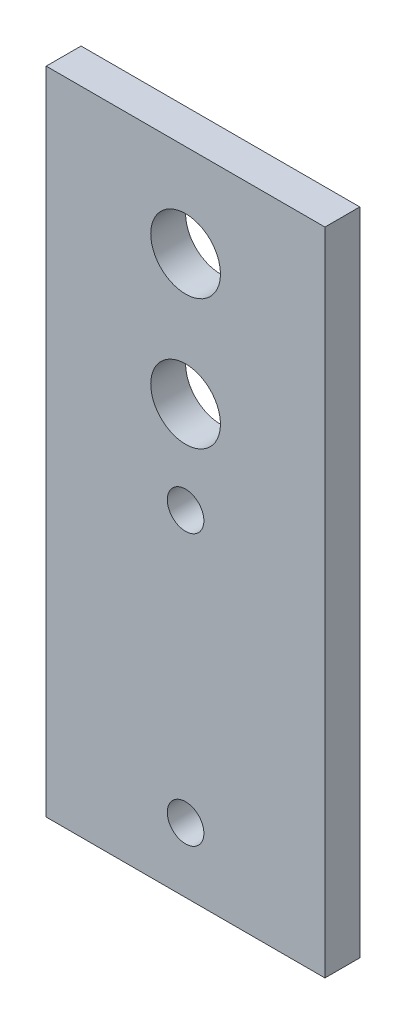
ISO-10303-21;
HEADER;
FILE_DESCRIPTION(('STEP AP214'),'2;1');
FILE_NAME('part.step','',(''),(''),'','','');
FILE_SCHEMA(('AUTOMOTIVE_DESIGN { 1 0 10303 214 1 1 1 1 }'));
ENDSEC;
DATA;
#1=APPLICATION_CONTEXT('core data for automotive mechanical design processes');
#2=APPLICATION_PROTOCOL_DEFINITION('international standard','automotive_design',2000,#1);
#3=PRODUCT_CONTEXT('',#1,'mechanical');
#4=PRODUCT('Part','Part','',(#3));
#5=PRODUCT_RELATED_PRODUCT_CATEGORY('part','',(#4));
#6=PRODUCT_DEFINITION_FORMATION('','',#4);
#7=PRODUCT_DEFINITION_CONTEXT('part definition',#1,'design');
#8=PRODUCT_DEFINITION('design','',#6,#7);
#9=PRODUCT_DEFINITION_SHAPE('','',#8);
#10=(LENGTH_UNIT() NAMED_UNIT(*) SI_UNIT(.MILLI.,.METRE.));
#11=(NAMED_UNIT(*) PLANE_ANGLE_UNIT() SI_UNIT($,.RADIAN.));
#12=(NAMED_UNIT(*) SI_UNIT($,.STERADIAN.) SOLID_ANGLE_UNIT());
#13=UNCERTAINTY_MEASURE_WITH_UNIT(LENGTH_MEASURE(1.E-05),#10,'distance_accuracy_value','');
#14=(GEOMETRIC_REPRESENTATION_CONTEXT(3) GLOBAL_UNCERTAINTY_ASSIGNED_CONTEXT((#13)) GLOBAL_UNIT_ASSIGNED_CONTEXT((#10,
#11,#12)) REPRESENTATION_CONTEXT('',''));
#15=CARTESIAN_POINT('',(0.,0.,0.));
#16=DIRECTION('',(0.,0.,1.));
#17=DIRECTION('',(1.,0.,0.));
#18=AXIS2_PLACEMENT_3D('',#15,#16,#17);
#19=CARTESIAN_POINT('',(0.,0.,4.7625));
#20=DIRECTION('',(0.,0.,-1.));
#21=DIRECTION('',(-1.,0.,0.));
#22=AXIS2_PLACEMENT_3D('',#19,#20,#21);
#23=PLANE('',#22);
#24=DIRECTION('',(0.,-1.,0.));
#25=VECTOR('',#24,1.);
#26=CARTESIAN_POINT('',(0.,0.,4.7625));
#27=LINE('',#26,#25);
#28=CARTESIAN_POINT('',(0.,88.9,4.7625));
#29=VERTEX_POINT('',#28);
#30=CARTESIAN_POINT('',(0.,0.,4.7625));
#31=VERTEX_POINT('',#30);
#32=EDGE_CURVE('E93',#29,#31,#27,.T.);
#33=ORIENTED_EDGE('',*,*,#32,.T.);
#34=DIRECTION('',(1.,0.,0.));
#35=VECTOR('',#34,1.);
#36=CARTESIAN_POINT('',(0.,0.,4.7625));
#37=LINE('',#36,#35);
#38=CARTESIAN_POINT('',(38.1,0.,4.7625));
#39=VERTEX_POINT('',#38);
#40=EDGE_CURVE('E88',#31,#39,#37,.T.);
#41=ORIENTED_EDGE('',*,*,#40,.T.);
#42=DIRECTION('',(0.,1.,0.));
#43=VECTOR('',#42,1.);
#44=CARTESIAN_POINT('',(38.1,0.,4.7625));
#45=LINE('',#44,#43);
#46=CARTESIAN_POINT('',(38.1,88.9,4.7625));
#47=VERTEX_POINT('',#46);
#48=EDGE_CURVE('E91',#39,#47,#45,.T.);
#49=ORIENTED_EDGE('',*,*,#48,.T.);
#50=DIRECTION('',(-1.,0.,0.));
#51=VECTOR('',#50,1.);
#52=CARTESIAN_POINT('',(0.,88.9,4.7625));
#53=LINE('',#52,#51);
#54=EDGE_CURVE('E58',#47,#29,#53,.T.);
#55=ORIENTED_EDGE('',*,*,#54,.T.);
#56=EDGE_LOOP('',(#33,#41,#49,#55));
#57=FACE_BOUND('',#56,.T.);
#58=CARTESIAN_POINT('',(19.05,76.2,4.7625));
#59=DIRECTION('',(0.,0.,1.));
#60=DIRECTION('',(1.,0.,0.));
#61=AXIS2_PLACEMENT_3D('',#58,#59,#60);
#62=CIRCLE('',#61,4.7625);
#63=CARTESIAN_POINT('',(14.2875,76.2,4.7625));
#64=VERTEX_POINT('',#63);
#65=EDGE_CURVE('E108',#64,#64,#62,.T.);
#66=ORIENTED_EDGE('',*,*,#65,.F.);
#67=EDGE_LOOP('',(#66));
#68=FACE_BOUND('',#67,.T.);
#69=CARTESIAN_POINT('',(19.05,8.85,4.7625));
#70=DIRECTION('',(0.,0.,1.));
#71=DIRECTION('',(1.,0.,0.));
#72=AXIS2_PLACEMENT_3D('',#69,#70,#71);
#73=CIRCLE('',#72,2.5);
#74=CARTESIAN_POINT('',(16.55,8.85,4.7625));
#75=VERTEX_POINT('',#74);
#76=EDGE_CURVE('E123',#75,#75,#73,.T.);
#77=ORIENTED_EDGE('',*,*,#76,.F.);
#78=EDGE_LOOP('',(#77));
#79=FACE_BOUND('',#78,.T.);
#80=CARTESIAN_POINT('',(19.05,45.85,4.7625));
#81=DIRECTION('',(0.,0.,1.));
#82=DIRECTION('',(1.,0.,0.));
#83=AXIS2_PLACEMENT_3D('',#80,#81,#82);
#84=CIRCLE('',#83,2.5);
#85=CARTESIAN_POINT('',(16.55,45.85,4.7625));
#86=VERTEX_POINT('',#85);
#87=EDGE_CURVE('E129',#86,#86,#84,.T.);
#88=ORIENTED_EDGE('',*,*,#87,.F.);
#89=EDGE_LOOP('',(#88));
#90=FACE_BOUND('',#89,.T.);
#91=CARTESIAN_POINT('',(19.05,58.42,4.7625));
#92=DIRECTION('',(0.,0.,1.));
#93=DIRECTION('',(1.,0.,0.));
#94=AXIS2_PLACEMENT_3D('',#91,#92,#93);
#95=CIRCLE('',#94,4.7625);
#96=CARTESIAN_POINT('',(14.2875,58.42,4.7625));
#97=VERTEX_POINT('',#96);
#98=EDGE_CURVE('E135',#97,#97,#95,.T.);
#99=ORIENTED_EDGE('',*,*,#98,.F.);
#100=EDGE_LOOP('',(#99));
#101=FACE_BOUND('',#100,.T.);
#102=ADVANCED_FACE('F41',(#57,#68,#79,#90,#101),#23,.F.);
#103=CARTESIAN_POINT('',(0.,0.,0.));
#104=DIRECTION('',(0.,0.,-1.));
#105=DIRECTION('',(-1.,0.,0.));
#106=AXIS2_PLACEMENT_3D('',#103,#104,#105);
#107=PLANE('',#106);
#108=CARTESIAN_POINT('',(19.05,45.85,0.));
#109=DIRECTION('',(0.,0.,1.));
#110=DIRECTION('',(1.,0.,0.));
#111=AXIS2_PLACEMENT_3D('',#108,#109,#110);
#112=CIRCLE('',#111,2.5);
#113=CARTESIAN_POINT('',(16.55,45.85,0.));
#114=VERTEX_POINT('',#113);
#115=EDGE_CURVE('E132',#114,#114,#112,.T.);
#116=ORIENTED_EDGE('',*,*,#115,.T.);
#117=EDGE_LOOP('',(#116));
#118=FACE_BOUND('',#117,.T.);
#119=CARTESIAN_POINT('',(19.05,76.2,0.));
#120=DIRECTION('',(0.,0.,1.));
#121=DIRECTION('',(1.,0.,0.));
#122=AXIS2_PLACEMENT_3D('',#119,#120,#121);
#123=CIRCLE('',#122,4.7625);
#124=CARTESIAN_POINT('',(14.2875,76.2,0.));
#125=VERTEX_POINT('',#124);
#126=EDGE_CURVE('E120',#125,#125,#123,.T.);
#127=ORIENTED_EDGE('',*,*,#126,.T.);
#128=EDGE_LOOP('',(#127));
#129=FACE_BOUND('',#128,.T.);
#130=DIRECTION('',(0.,-1.,0.));
#131=VECTOR('',#130,1.);
#132=CARTESIAN_POINT('',(0.,0.,0.));
#133=LINE('',#132,#131);
#134=CARTESIAN_POINT('',(0.,88.9,0.));
#135=VERTEX_POINT('',#134);
#136=CARTESIAN_POINT('',(0.,0.,0.));
#137=VERTEX_POINT('',#136);
#138=EDGE_CURVE('E105',#135,#137,#133,.T.);
#139=ORIENTED_EDGE('',*,*,#138,.F.);
#140=DIRECTION('',(-1.,0.,0.));
#141=VECTOR('',#140,1.);
#142=CARTESIAN_POINT('',(0.,88.9,0.));
#143=LINE('',#142,#141);
#144=CARTESIAN_POINT('',(38.1,88.9,0.));
#145=VERTEX_POINT('',#144);
#146=EDGE_CURVE('E81',#145,#135,#143,.T.);
#147=ORIENTED_EDGE('',*,*,#146,.F.);
#148=DIRECTION('',(0.,1.,0.));
#149=VECTOR('',#148,1.);
#150=CARTESIAN_POINT('',(38.1,0.,0.));
#151=LINE('',#150,#149);
#152=CARTESIAN_POINT('',(38.1,0.,0.));
#153=VERTEX_POINT('',#152);
#154=EDGE_CURVE('E75',#153,#145,#151,.T.);
#155=ORIENTED_EDGE('',*,*,#154,.F.);
#156=DIRECTION('',(1.,0.,0.));
#157=VECTOR('',#156,1.);
#158=CARTESIAN_POINT('',(0.,0.,0.));
#159=LINE('',#158,#157);
#160=EDGE_CURVE('E97',#137,#153,#159,.T.);
#161=ORIENTED_EDGE('',*,*,#160,.F.);
#162=EDGE_LOOP('',(#139,#147,#155,#161));
#163=FACE_BOUND('',#162,.T.);
#164=CARTESIAN_POINT('',(19.05,8.85,0.));
#165=DIRECTION('',(0.,0.,1.));
#166=DIRECTION('',(1.,0.,0.));
#167=AXIS2_PLACEMENT_3D('',#164,#165,#166);
#168=CIRCLE('',#167,2.5);
#169=CARTESIAN_POINT('',(16.55,8.85,0.));
#170=VERTEX_POINT('',#169);
#171=EDGE_CURVE('E126',#170,#170,#168,.T.);
#172=ORIENTED_EDGE('',*,*,#171,.T.);
#173=EDGE_LOOP('',(#172));
#174=FACE_BOUND('',#173,.T.);
#175=CARTESIAN_POINT('',(19.05,58.42,0.));
#176=DIRECTION('',(0.,0.,1.));
#177=DIRECTION('',(1.,0.,0.));
#178=AXIS2_PLACEMENT_3D('',#175,#176,#177);
#179=CIRCLE('',#178,4.7625);
#180=CARTESIAN_POINT('',(14.2875,58.42,0.));
#181=VERTEX_POINT('',#180);
#182=EDGE_CURVE('E138',#181,#181,#179,.T.);
#183=ORIENTED_EDGE('',*,*,#182,.T.);
#184=EDGE_LOOP('',(#183));
#185=FACE_BOUND('',#184,.T.);
#186=ADVANCED_FACE('F116',(#118,#129,#163,#174,#185),#107,.T.);
#187=CARTESIAN_POINT('',(0.,0.,4.7625));
#188=DIRECTION('',(1.,0.,0.));
#189=DIRECTION('',(0.,0.,-1.));
#190=AXIS2_PLACEMENT_3D('',#187,#188,#189);
#191=PLANE('',#190);
#192=ORIENTED_EDGE('',*,*,#138,.T.);
#193=DIRECTION('',(0.,0.,-1.));
#194=VECTOR('',#193,1.);
#195=CARTESIAN_POINT('',(0.,0.,4.7625));
#196=LINE('',#195,#194);
#197=EDGE_CURVE('E11',#31,#137,#196,.T.);
#198=ORIENTED_EDGE('',*,*,#197,.F.);
#199=ORIENTED_EDGE('',*,*,#32,.F.);
#200=DIRECTION('',(0.,0.,-1.));
#201=VECTOR('',#200,1.);
#202=CARTESIAN_POINT('',(0.,88.9,4.7625));
#203=LINE('',#202,#201);
#204=EDGE_CURVE('E101',#29,#135,#203,.T.);
#205=ORIENTED_EDGE('',*,*,#204,.T.);
#206=EDGE_LOOP('',(#192,#198,#199,#205));
#207=FACE_BOUND('',#206,.T.);
#208=ADVANCED_FACE('F43',(#207),#191,.F.);
#209=CARTESIAN_POINT('',(0.,0.,4.7625));
#210=DIRECTION('',(0.,1.,0.));
#211=DIRECTION('',(0.,0.,1.));
#212=AXIS2_PLACEMENT_3D('',#209,#210,#211);
#213=PLANE('',#212);
#214=ORIENTED_EDGE('',*,*,#160,.T.);
#215=DIRECTION('',(0.,0.,-1.));
#216=VECTOR('',#215,1.);
#217=CARTESIAN_POINT('',(38.1,0.,4.7625));
#218=LINE('',#217,#216);
#219=EDGE_CURVE('E50',#39,#153,#218,.T.);
#220=ORIENTED_EDGE('',*,*,#219,.F.);
#221=ORIENTED_EDGE('',*,*,#40,.F.);
#222=ORIENTED_EDGE('',*,*,#197,.T.);
#223=EDGE_LOOP('',(#214,#220,#221,#222));
#224=FACE_BOUND('',#223,.T.);
#225=ADVANCED_FACE('F96',(#224),#213,.F.);
#226=CARTESIAN_POINT('',(38.1,0.,4.7625));
#227=DIRECTION('',(-1.,0.,0.));
#228=DIRECTION('',(0.,0.,1.));
#229=AXIS2_PLACEMENT_3D('',#226,#227,#228);
#230=PLANE('',#229);
#231=ORIENTED_EDGE('',*,*,#154,.T.);
#232=DIRECTION('',(0.,0.,-1.));
#233=VECTOR('',#232,1.);
#234=CARTESIAN_POINT('',(38.1,88.9,4.7625));
#235=LINE('',#234,#233);
#236=EDGE_CURVE('E98',#47,#145,#235,.T.);
#237=ORIENTED_EDGE('',*,*,#236,.F.);
#238=ORIENTED_EDGE('',*,*,#48,.F.);
#239=ORIENTED_EDGE('',*,*,#219,.T.);
#240=EDGE_LOOP('',(#231,#237,#238,#239));
#241=FACE_BOUND('',#240,.T.);
#242=ADVANCED_FACE('F99',(#241),#230,.F.);
#243=CARTESIAN_POINT('',(0.,88.9,4.7625));
#244=DIRECTION('',(0.,-1.,0.));
#245=DIRECTION('',(0.,0.,-1.));
#246=AXIS2_PLACEMENT_3D('',#243,#244,#245);
#247=PLANE('',#246);
#248=ORIENTED_EDGE('',*,*,#146,.T.);
#249=ORIENTED_EDGE('',*,*,#204,.F.);
#250=ORIENTED_EDGE('',*,*,#54,.F.);
#251=ORIENTED_EDGE('',*,*,#236,.T.);
#252=EDGE_LOOP('',(#248,#249,#250,#251));
#253=FACE_BOUND('',#252,.T.);
#254=ADVANCED_FACE('F113',(#253),#247,.F.);
#255=CARTESIAN_POINT('',(19.05,76.2,4.7625));
#256=DIRECTION('',(0.,0.,-1.));
#257=DIRECTION('',(-1.,0.,0.));
#258=AXIS2_PLACEMENT_3D('',#255,#256,#257);
#259=CYLINDRICAL_SURFACE('',#258,4.7625);
#260=CARTESIAN_POINT('',(14.2875,76.2,4.7625));
#261=CARTESIAN_POINT('',(14.2875,76.2,4.712890625));
#262=CARTESIAN_POINT('',(14.2875,76.2,4.66328125));
#263=CARTESIAN_POINT('',(14.2875,76.2,4.5640625));
#264=CARTESIAN_POINT('',(14.2875,76.2,4.514453125));
#265=CARTESIAN_POINT('',(14.2875,76.2,4.415234375));
#266=CARTESIAN_POINT('',(14.2875,76.2,4.365625));
#267=CARTESIAN_POINT('',(14.2875,76.2,4.26640625));
#268=CARTESIAN_POINT('',(14.2875,76.2,4.216796875));
#269=CARTESIAN_POINT('',(14.2875,76.2,4.117578125));
#270=CARTESIAN_POINT('',(14.2875,76.2,4.06796875));
#271=CARTESIAN_POINT('',(14.2875,76.2,3.96875));
#272=CARTESIAN_POINT('',(14.2875,76.2,3.919140625));
#273=CARTESIAN_POINT('',(14.2875,76.2,3.819921875));
#274=CARTESIAN_POINT('',(14.2875,76.2,3.7703125));
#275=CARTESIAN_POINT('',(14.2875,76.2,3.67109375));
#276=CARTESIAN_POINT('',(14.2875,76.2,3.621484375));
#277=CARTESIAN_POINT('',(14.2875,76.2,3.522265625));
#278=CARTESIAN_POINT('',(14.2875,76.2,3.47265625));
#279=CARTESIAN_POINT('',(14.2875,76.2,3.3734375));
#280=CARTESIAN_POINT('',(14.2875,76.2,3.323828125));
#281=CARTESIAN_POINT('',(14.2875,76.2,3.224609375));
#282=CARTESIAN_POINT('',(14.2875,76.2,3.175));
#283=CARTESIAN_POINT('',(14.2875,76.2,3.07578125));
#284=CARTESIAN_POINT('',(14.2875,76.2,3.026171875));
#285=CARTESIAN_POINT('',(14.2875,76.2,2.926953125));
#286=CARTESIAN_POINT('',(14.2875,76.2,2.87734375));
#287=CARTESIAN_POINT('',(14.2875,76.2,2.778125));
#288=CARTESIAN_POINT('',(14.2875,76.2,2.728515625));
#289=CARTESIAN_POINT('',(14.2875,76.2,2.629296875));
#290=CARTESIAN_POINT('',(14.2875,76.2,2.5796875));
#291=CARTESIAN_POINT('',(14.2875,76.2,2.48046875));
#292=CARTESIAN_POINT('',(14.2875,76.2,2.430859375));
#293=CARTESIAN_POINT('',(14.2875,76.2,2.331640625));
#294=CARTESIAN_POINT('',(14.2875,76.2,2.28203125));
#295=CARTESIAN_POINT('',(14.2875,76.2,2.1828125));
#296=CARTESIAN_POINT('',(14.2875,76.2,2.133203125));
#297=CARTESIAN_POINT('',(14.2875,76.2,2.033984375));
#298=CARTESIAN_POINT('',(14.2875,76.2,1.984375));
#299=CARTESIAN_POINT('',(14.2875,76.2,1.88515625));
#300=CARTESIAN_POINT('',(14.2875,76.2,1.835546875));
#301=CARTESIAN_POINT('',(14.2875,76.2,1.736328125));
#302=CARTESIAN_POINT('',(14.2875,76.2,1.68671875));
#303=CARTESIAN_POINT('',(14.2875,76.2,1.5875));
#304=CARTESIAN_POINT('',(14.2875,76.2,1.537890625));
#305=CARTESIAN_POINT('',(14.2875,76.2,1.438671875));
#306=CARTESIAN_POINT('',(14.2875,76.2,1.3890625));
#307=CARTESIAN_POINT('',(14.2875,76.2,1.28984375));
#308=CARTESIAN_POINT('',(14.2875,76.2,1.240234375));
#309=CARTESIAN_POINT('',(14.2875,76.2,1.141015625));
#310=CARTESIAN_POINT('',(14.2875,76.2,1.09140625));
#311=CARTESIAN_POINT('',(14.2875,76.2,0.992187499999999));
#312=CARTESIAN_POINT('',(14.2875,76.2,0.942578124999999));
#313=CARTESIAN_POINT('',(14.2875,76.2,0.843359375));
#314=CARTESIAN_POINT('',(14.2875,76.2,0.79375));
#315=CARTESIAN_POINT('',(14.2875,76.2,0.69453125));
#316=CARTESIAN_POINT('',(14.2875,76.2,0.644921875));
#317=CARTESIAN_POINT('',(14.2875,76.2,0.545703125));
#318=CARTESIAN_POINT('',(14.2875,76.2,0.49609375));
#319=CARTESIAN_POINT('',(14.2875,76.2,0.396875));
#320=CARTESIAN_POINT('',(14.2875,76.2,0.347265625));
#321=CARTESIAN_POINT('',(14.2875,76.2,0.248046875));
#322=CARTESIAN_POINT('',(14.2875,76.2,0.1984375));
#323=CARTESIAN_POINT('',(14.2875,76.2,0.09921875));
#324=CARTESIAN_POINT('',(14.2875,76.2,0.049609375));
#325=CARTESIAN_POINT('',(14.2875,76.2,0.));
#326=B_SPLINE_CURVE_WITH_KNOTS('',3,(#260,#261,#262,#263,#264,#265,#266,#267,#268,#269,#270,
#271,#272,#273,#274,#275,#276,#277,#278,#279,#280,#281,#282,#283,#284,#285,#286,#287,#288,#289,
#290,#291,#292,#293,#294,#295,#296,#297,#298,#299,#300,#301,#302,#303,#304,#305,#306,#307,#308,
#309,#310,#311,#312,#313,#314,#315,#316,#317,#318,#319,#320,#321,#322,#323,#324,#325),
.UNSPECIFIED.,.F.,.F.,(4,2,2,2,2,2,2,2,2,2,2,2,2,2,2,2,2,2,2,2,2,2,2,2,2,2,2,2,2,2,2,2,4),(0.,
0.148828125,0.29765625,0.446484375,0.5953125,0.744140625,0.892968750000001,1.041796875,1.190625,
1.339453125,1.48828125,1.637109375,1.7859375,1.934765625,2.08359375,2.232421875,2.38125,
2.530078125,2.67890625,2.827734375,2.9765625,3.125390625,3.27421875,3.423046875,3.571875,
3.720703125,3.86953125,4.018359375,4.1671875,4.316015625,4.46484375,4.613671875,4.7625),.UNSPECIFIED.);
#327=EDGE_CURVE('BSEAM155',#64,#125,#326,.T.);
#328=ORIENTED_EDGE('',*,*,#65,.T.);
#329=ORIENTED_EDGE('',*,*,#126,.F.);
#330=ORIENTED_EDGE('',*,*,#327,.T.);
#331=ORIENTED_EDGE('',*,*,#327,.F.);
#332=EDGE_LOOP('',(#328,#330,#329,#331));
#333=FACE_BOUND('',#332,.T.);
#334=ADVANCED_FACE('F155',(#333),#259,.F.);
#335=CARTESIAN_POINT('',(19.05,8.85,4.7625));
#336=DIRECTION('',(0.,0.,-1.));
#337=DIRECTION('',(-1.,0.,0.));
#338=AXIS2_PLACEMENT_3D('',#335,#336,#337);
#339=CYLINDRICAL_SURFACE('',#338,2.5);
#340=CARTESIAN_POINT('',(16.55,8.85,4.7625));
#341=CARTESIAN_POINT('',(16.55,8.85,4.712890625));
#342=CARTESIAN_POINT('',(16.55,8.85,4.66328125));
#343=CARTESIAN_POINT('',(16.55,8.85,4.5640625));
#344=CARTESIAN_POINT('',(16.55,8.85,4.514453125));
#345=CARTESIAN_POINT('',(16.55,8.85,4.415234375));
#346=CARTESIAN_POINT('',(16.55,8.85,4.365625));
#347=CARTESIAN_POINT('',(16.55,8.85,4.26640625));
#348=CARTESIAN_POINT('',(16.55,8.85,4.216796875));
#349=CARTESIAN_POINT('',(16.55,8.85,4.117578125));
#350=CARTESIAN_POINT('',(16.55,8.85,4.06796875));
#351=CARTESIAN_POINT('',(16.55,8.85,3.96875));
#352=CARTESIAN_POINT('',(16.55,8.85,3.919140625));
#353=CARTESIAN_POINT('',(16.55,8.85,3.819921875));
#354=CARTESIAN_POINT('',(16.55,8.85,3.7703125));
#355=CARTESIAN_POINT('',(16.55,8.85,3.67109375));
#356=CARTESIAN_POINT('',(16.55,8.85,3.621484375));
#357=CARTESIAN_POINT('',(16.55,8.85,3.522265625));
#358=CARTESIAN_POINT('',(16.55,8.85,3.47265625));
#359=CARTESIAN_POINT('',(16.55,8.85,3.3734375));
#360=CARTESIAN_POINT('',(16.55,8.85,3.323828125));
#361=CARTESIAN_POINT('',(16.55,8.85,3.224609375));
#362=CARTESIAN_POINT('',(16.55,8.85,3.175));
#363=CARTESIAN_POINT('',(16.55,8.85,3.07578125));
#364=CARTESIAN_POINT('',(16.55,8.85,3.026171875));
#365=CARTESIAN_POINT('',(16.55,8.85,2.926953125));
#366=CARTESIAN_POINT('',(16.55,8.85,2.87734375));
#367=CARTESIAN_POINT('',(16.55,8.85,2.778125));
#368=CARTESIAN_POINT('',(16.55,8.85,2.728515625));
#369=CARTESIAN_POINT('',(16.55,8.85,2.629296875));
#370=CARTESIAN_POINT('',(16.55,8.85,2.5796875));
#371=CARTESIAN_POINT('',(16.55,8.85,2.48046875));
#372=CARTESIAN_POINT('',(16.55,8.85,2.430859375));
#373=CARTESIAN_POINT('',(16.55,8.85,2.331640625));
#374=CARTESIAN_POINT('',(16.55,8.85,2.28203125));
#375=CARTESIAN_POINT('',(16.55,8.85,2.1828125));
#376=CARTESIAN_POINT('',(16.55,8.85,2.133203125));
#377=CARTESIAN_POINT('',(16.55,8.85,2.033984375));
#378=CARTESIAN_POINT('',(16.55,8.85,1.984375));
#379=CARTESIAN_POINT('',(16.55,8.85,1.88515625));
#380=CARTESIAN_POINT('',(16.55,8.85,1.835546875));
#381=CARTESIAN_POINT('',(16.55,8.85,1.736328125));
#382=CARTESIAN_POINT('',(16.55,8.85,1.68671875));
#383=CARTESIAN_POINT('',(16.55,8.85,1.5875));
#384=CARTESIAN_POINT('',(16.55,8.85,1.537890625));
#385=CARTESIAN_POINT('',(16.55,8.85,1.438671875));
#386=CARTESIAN_POINT('',(16.55,8.85,1.3890625));
#387=CARTESIAN_POINT('',(16.55,8.85,1.28984375));
#388=CARTESIAN_POINT('',(16.55,8.85,1.240234375));
#389=CARTESIAN_POINT('',(16.55,8.85,1.141015625));
#390=CARTESIAN_POINT('',(16.55,8.85,1.09140625));
#391=CARTESIAN_POINT('',(16.55,8.85,0.992187499999999));
#392=CARTESIAN_POINT('',(16.55,8.85,0.942578124999999));
#393=CARTESIAN_POINT('',(16.55,8.85,0.843359375));
#394=CARTESIAN_POINT('',(16.55,8.85,0.79375));
#395=CARTESIAN_POINT('',(16.55,8.85,0.69453125));
#396=CARTESIAN_POINT('',(16.55,8.85,0.644921875));
#397=CARTESIAN_POINT('',(16.55,8.85,0.545703125));
#398=CARTESIAN_POINT('',(16.55,8.85,0.49609375));
#399=CARTESIAN_POINT('',(16.55,8.85,0.396875));
#400=CARTESIAN_POINT('',(16.55,8.85,0.347265625));
#401=CARTESIAN_POINT('',(16.55,8.85,0.248046875));
#402=CARTESIAN_POINT('',(16.55,8.85,0.1984375));
#403=CARTESIAN_POINT('',(16.55,8.85,0.09921875));
#404=CARTESIAN_POINT('',(16.55,8.85,0.049609375));
#405=CARTESIAN_POINT('',(16.55,8.85,0.));
#406=B_SPLINE_CURVE_WITH_KNOTS('',3,(#340,#341,#342,#343,#344,#345,#346,#347,#348,#349,#350,
#351,#352,#353,#354,#355,#356,#357,#358,#359,#360,#361,#362,#363,#364,#365,#366,#367,#368,#369,
#370,#371,#372,#373,#374,#375,#376,#377,#378,#379,#380,#381,#382,#383,#384,#385,#386,#387,#388,
#389,#390,#391,#392,#393,#394,#395,#396,#397,#398,#399,#400,#401,#402,#403,#404,#405),
.UNSPECIFIED.,.F.,.F.,(4,2,2,2,2,2,2,2,2,2,2,2,2,2,2,2,2,2,2,2,2,2,2,2,2,2,2,2,2,2,2,2,4),(0.,
0.148828125,0.29765625,0.446484375,0.5953125,0.744140625,0.892968750000001,1.041796875,1.190625,
1.339453125,1.48828125,1.637109375,1.7859375,1.934765625,2.08359375,2.232421875,2.38125,
2.530078125,2.67890625,2.827734375,2.9765625,3.125390625,3.27421875,3.423046875,3.571875,
3.720703125,3.86953125,4.018359375,4.1671875,4.316015625,4.46484375,4.613671875,4.7625),.UNSPECIFIED.);
#407=EDGE_CURVE('BSEAM209',#75,#170,#406,.T.);
#408=ORIENTED_EDGE('',*,*,#76,.T.);
#409=ORIENTED_EDGE('',*,*,#171,.F.);
#410=ORIENTED_EDGE('',*,*,#407,.T.);
#411=ORIENTED_EDGE('',*,*,#407,.F.);
#412=EDGE_LOOP('',(#408,#410,#409,#411));
#413=FACE_BOUND('',#412,.T.);
#414=ADVANCED_FACE('F209',(#413),#339,.F.);
#415=CARTESIAN_POINT('',(19.05,45.85,4.7625));
#416=DIRECTION('',(0.,0.,-1.));
#417=DIRECTION('',(-1.,0.,0.));
#418=AXIS2_PLACEMENT_3D('',#415,#416,#417);
#419=CYLINDRICAL_SURFACE('',#418,2.5);
#420=CARTESIAN_POINT('',(16.55,45.85,4.7625));
#421=CARTESIAN_POINT('',(16.55,45.85,4.712890625));
#422=CARTESIAN_POINT('',(16.55,45.85,4.66328125));
#423=CARTESIAN_POINT('',(16.55,45.85,4.5640625));
#424=CARTESIAN_POINT('',(16.55,45.85,4.514453125));
#425=CARTESIAN_POINT('',(16.55,45.85,4.415234375));
#426=CARTESIAN_POINT('',(16.55,45.85,4.365625));
#427=CARTESIAN_POINT('',(16.55,45.85,4.26640625));
#428=CARTESIAN_POINT('',(16.55,45.85,4.216796875));
#429=CARTESIAN_POINT('',(16.55,45.85,4.117578125));
#430=CARTESIAN_POINT('',(16.55,45.85,4.06796875));
#431=CARTESIAN_POINT('',(16.55,45.85,3.96875));
#432=CARTESIAN_POINT('',(16.55,45.85,3.919140625));
#433=CARTESIAN_POINT('',(16.55,45.85,3.819921875));
#434=CARTESIAN_POINT('',(16.55,45.85,3.7703125));
#435=CARTESIAN_POINT('',(16.55,45.85,3.67109375));
#436=CARTESIAN_POINT('',(16.55,45.85,3.621484375));
#437=CARTESIAN_POINT('',(16.55,45.85,3.522265625));
#438=CARTESIAN_POINT('',(16.55,45.85,3.47265625));
#439=CARTESIAN_POINT('',(16.55,45.85,3.3734375));
#440=CARTESIAN_POINT('',(16.55,45.85,3.323828125));
#441=CARTESIAN_POINT('',(16.55,45.85,3.224609375));
#442=CARTESIAN_POINT('',(16.55,45.85,3.175));
#443=CARTESIAN_POINT('',(16.55,45.85,3.07578125));
#444=CARTESIAN_POINT('',(16.55,45.85,3.026171875));
#445=CARTESIAN_POINT('',(16.55,45.85,2.926953125));
#446=CARTESIAN_POINT('',(16.55,45.85,2.87734375));
#447=CARTESIAN_POINT('',(16.55,45.85,2.778125));
#448=CARTESIAN_POINT('',(16.55,45.85,2.728515625));
#449=CARTESIAN_POINT('',(16.55,45.85,2.629296875));
#450=CARTESIAN_POINT('',(16.55,45.85,2.5796875));
#451=CARTESIAN_POINT('',(16.55,45.85,2.48046875));
#452=CARTESIAN_POINT('',(16.55,45.85,2.430859375));
#453=CARTESIAN_POINT('',(16.55,45.85,2.331640625));
#454=CARTESIAN_POINT('',(16.55,45.85,2.28203125));
#455=CARTESIAN_POINT('',(16.55,45.85,2.1828125));
#456=CARTESIAN_POINT('',(16.55,45.85,2.133203125));
#457=CARTESIAN_POINT('',(16.55,45.85,2.033984375));
#458=CARTESIAN_POINT('',(16.55,45.85,1.984375));
#459=CARTESIAN_POINT('',(16.55,45.85,1.88515625));
#460=CARTESIAN_POINT('',(16.55,45.85,1.835546875));
#461=CARTESIAN_POINT('',(16.55,45.85,1.736328125));
#462=CARTESIAN_POINT('',(16.55,45.85,1.68671875));
#463=CARTESIAN_POINT('',(16.55,45.85,1.5875));
#464=CARTESIAN_POINT('',(16.55,45.85,1.537890625));
#465=CARTESIAN_POINT('',(16.55,45.85,1.438671875));
#466=CARTESIAN_POINT('',(16.55,45.85,1.3890625));
#467=CARTESIAN_POINT('',(16.55,45.85,1.28984375));
#468=CARTESIAN_POINT('',(16.55,45.85,1.240234375));
#469=CARTESIAN_POINT('',(16.55,45.85,1.141015625));
#470=CARTESIAN_POINT('',(16.55,45.85,1.09140625));
#471=CARTESIAN_POINT('',(16.55,45.85,0.992187499999999));
#472=CARTESIAN_POINT('',(16.55,45.85,0.942578124999999));
#473=CARTESIAN_POINT('',(16.55,45.85,0.843359375));
#474=CARTESIAN_POINT('',(16.55,45.85,0.79375));
#475=CARTESIAN_POINT('',(16.55,45.85,0.69453125));
#476=CARTESIAN_POINT('',(16.55,45.85,0.644921875));
#477=CARTESIAN_POINT('',(16.55,45.85,0.545703125));
#478=CARTESIAN_POINT('',(16.55,45.85,0.49609375));
#479=CARTESIAN_POINT('',(16.55,45.85,0.396875));
#480=CARTESIAN_POINT('',(16.55,45.85,0.347265625));
#481=CARTESIAN_POINT('',(16.55,45.85,0.248046875));
#482=CARTESIAN_POINT('',(16.55,45.85,0.1984375));
#483=CARTESIAN_POINT('',(16.55,45.85,0.09921875));
#484=CARTESIAN_POINT('',(16.55,45.85,0.049609375));
#485=CARTESIAN_POINT('',(16.55,45.85,0.));
#486=B_SPLINE_CURVE_WITH_KNOTS('',3,(#420,#421,#422,#423,#424,#425,#426,#427,#428,#429,#430,
#431,#432,#433,#434,#435,#436,#437,#438,#439,#440,#441,#442,#443,#444,#445,#446,#447,#448,#449,
#450,#451,#452,#453,#454,#455,#456,#457,#458,#459,#460,#461,#462,#463,#464,#465,#466,#467,#468,
#469,#470,#471,#472,#473,#474,#475,#476,#477,#478,#479,#480,#481,#482,#483,#484,#485),
.UNSPECIFIED.,.F.,.F.,(4,2,2,2,2,2,2,2,2,2,2,2,2,2,2,2,2,2,2,2,2,2,2,2,2,2,2,2,2,2,2,2,4),(0.,
0.148828125,0.29765625,0.446484375,0.5953125,0.744140625,0.892968750000001,1.041796875,1.190625,
1.339453125,1.48828125,1.637109375,1.7859375,1.934765625,2.08359375,2.232421875,2.38125,
2.530078125,2.67890625,2.827734375,2.9765625,3.125390625,3.27421875,3.423046875,3.571875,
3.720703125,3.86953125,4.018359375,4.1671875,4.316015625,4.46484375,4.613671875,4.7625),.UNSPECIFIED.);
#487=EDGE_CURVE('BSEAM218',#86,#114,#486,.T.);
#488=ORIENTED_EDGE('',*,*,#87,.T.);
#489=ORIENTED_EDGE('',*,*,#115,.F.);
#490=ORIENTED_EDGE('',*,*,#487,.T.);
#491=ORIENTED_EDGE('',*,*,#487,.F.);
#492=EDGE_LOOP('',(#488,#490,#489,#491));
#493=FACE_BOUND('',#492,.T.);
#494=ADVANCED_FACE('F218',(#493),#419,.F.);
#495=CARTESIAN_POINT('',(19.05,58.42,4.7625));
#496=DIRECTION('',(0.,0.,-1.));
#497=DIRECTION('',(-1.,0.,0.));
#498=AXIS2_PLACEMENT_3D('',#495,#496,#497);
#499=CYLINDRICAL_SURFACE('',#498,4.7625);
#500=CARTESIAN_POINT('',(14.2875,58.42,4.7625));
#501=CARTESIAN_POINT('',(14.2875,58.42,4.712890625));
#502=CARTESIAN_POINT('',(14.2875,58.42,4.66328125));
#503=CARTESIAN_POINT('',(14.2875,58.42,4.5640625));
#504=CARTESIAN_POINT('',(14.2875,58.42,4.514453125));
#505=CARTESIAN_POINT('',(14.2875,58.42,4.415234375));
#506=CARTESIAN_POINT('',(14.2875,58.42,4.365625));
#507=CARTESIAN_POINT('',(14.2875,58.42,4.26640625));
#508=CARTESIAN_POINT('',(14.2875,58.42,4.216796875));
#509=CARTESIAN_POINT('',(14.2875,58.42,4.117578125));
#510=CARTESIAN_POINT('',(14.2875,58.42,4.06796875));
#511=CARTESIAN_POINT('',(14.2875,58.42,3.96875));
#512=CARTESIAN_POINT('',(14.2875,58.42,3.919140625));
#513=CARTESIAN_POINT('',(14.2875,58.42,3.819921875));
#514=CARTESIAN_POINT('',(14.2875,58.42,3.7703125));
#515=CARTESIAN_POINT('',(14.2875,58.42,3.67109375));
#516=CARTESIAN_POINT('',(14.2875,58.42,3.621484375));
#517=CARTESIAN_POINT('',(14.2875,58.42,3.522265625));
#518=CARTESIAN_POINT('',(14.2875,58.42,3.47265625));
#519=CARTESIAN_POINT('',(14.2875,58.42,3.3734375));
#520=CARTESIAN_POINT('',(14.2875,58.42,3.323828125));
#521=CARTESIAN_POINT('',(14.2875,58.42,3.224609375));
#522=CARTESIAN_POINT('',(14.2875,58.42,3.175));
#523=CARTESIAN_POINT('',(14.2875,58.42,3.07578125));
#524=CARTESIAN_POINT('',(14.2875,58.42,3.026171875));
#525=CARTESIAN_POINT('',(14.2875,58.42,2.926953125));
#526=CARTESIAN_POINT('',(14.2875,58.42,2.87734375));
#527=CARTESIAN_POINT('',(14.2875,58.42,2.778125));
#528=CARTESIAN_POINT('',(14.2875,58.42,2.728515625));
#529=CARTESIAN_POINT('',(14.2875,58.42,2.629296875));
#530=CARTESIAN_POINT('',(14.2875,58.42,2.5796875));
#531=CARTESIAN_POINT('',(14.2875,58.42,2.48046875));
#532=CARTESIAN_POINT('',(14.2875,58.42,2.430859375));
#533=CARTESIAN_POINT('',(14.2875,58.42,2.331640625));
#534=CARTESIAN_POINT('',(14.2875,58.42,2.28203125));
#535=CARTESIAN_POINT('',(14.2875,58.42,2.1828125));
#536=CARTESIAN_POINT('',(14.2875,58.42,2.133203125));
#537=CARTESIAN_POINT('',(14.2875,58.42,2.033984375));
#538=CARTESIAN_POINT('',(14.2875,58.42,1.984375));
#539=CARTESIAN_POINT('',(14.2875,58.42,1.88515625));
#540=CARTESIAN_POINT('',(14.2875,58.42,1.835546875));
#541=CARTESIAN_POINT('',(14.2875,58.42,1.736328125));
#542=CARTESIAN_POINT('',(14.2875,58.42,1.68671875));
#543=CARTESIAN_POINT('',(14.2875,58.42,1.5875));
#544=CARTESIAN_POINT('',(14.2875,58.42,1.537890625));
#545=CARTESIAN_POINT('',(14.2875,58.42,1.438671875));
#546=CARTESIAN_POINT('',(14.2875,58.42,1.3890625));
#547=CARTESIAN_POINT('',(14.2875,58.42,1.28984375));
#548=CARTESIAN_POINT('',(14.2875,58.42,1.240234375));
#549=CARTESIAN_POINT('',(14.2875,58.42,1.141015625));
#550=CARTESIAN_POINT('',(14.2875,58.42,1.09140625));
#551=CARTESIAN_POINT('',(14.2875,58.42,0.992187499999999));
#552=CARTESIAN_POINT('',(14.2875,58.42,0.942578124999999));
#553=CARTESIAN_POINT('',(14.2875,58.42,0.843359375));
#554=CARTESIAN_POINT('',(14.2875,58.42,0.79375));
#555=CARTESIAN_POINT('',(14.2875,58.42,0.69453125));
#556=CARTESIAN_POINT('',(14.2875,58.42,0.644921875));
#557=CARTESIAN_POINT('',(14.2875,58.42,0.545703125));
#558=CARTESIAN_POINT('',(14.2875,58.42,0.49609375));
#559=CARTESIAN_POINT('',(14.2875,58.42,0.396875));
#560=CARTESIAN_POINT('',(14.2875,58.42,0.347265625));
#561=CARTESIAN_POINT('',(14.2875,58.42,0.248046875));
#562=CARTESIAN_POINT('',(14.2875,58.42,0.1984375));
#563=CARTESIAN_POINT('',(14.2875,58.42,0.09921875));
#564=CARTESIAN_POINT('',(14.2875,58.42,0.049609375));
#565=CARTESIAN_POINT('',(14.2875,58.42,0.));
#566=B_SPLINE_CURVE_WITH_KNOTS('',3,(#500,#501,#502,#503,#504,#505,#506,#507,#508,#509,#510,
#511,#512,#513,#514,#515,#516,#517,#518,#519,#520,#521,#522,#523,#524,#525,#526,#527,#528,#529,
#530,#531,#532,#533,#534,#535,#536,#537,#538,#539,#540,#541,#542,#543,#544,#545,#546,#547,#548,
#549,#550,#551,#552,#553,#554,#555,#556,#557,#558,#559,#560,#561,#562,#563,#564,#565),
.UNSPECIFIED.,.F.,.F.,(4,2,2,2,2,2,2,2,2,2,2,2,2,2,2,2,2,2,2,2,2,2,2,2,2,2,2,2,2,2,2,2,4),(0.,
0.148828125,0.29765625,0.446484375,0.5953125,0.744140625,0.892968750000001,1.041796875,1.190625,
1.339453125,1.48828125,1.637109375,1.7859375,1.934765625,2.08359375,2.232421875,2.38125,
2.530078125,2.67890625,2.827734375,2.9765625,3.125390625,3.27421875,3.423046875,3.571875,
3.720703125,3.86953125,4.018359375,4.1671875,4.316015625,4.46484375,4.613671875,4.7625),.UNSPECIFIED.);
#567=EDGE_CURVE('BSEAM144',#97,#181,#566,.T.);
#568=ORIENTED_EDGE('',*,*,#98,.T.);
#569=ORIENTED_EDGE('',*,*,#182,.F.);
#570=ORIENTED_EDGE('',*,*,#567,.T.);
#571=ORIENTED_EDGE('',*,*,#567,.F.);
#572=EDGE_LOOP('',(#568,#570,#569,#571));
#573=FACE_BOUND('',#572,.T.);
#574=ADVANCED_FACE('F144',(#573),#499,.F.);
#575=CLOSED_SHELL('',(#102,#186,#208,#225,#242,#254,#334,#414,#494,#574));
#576=MANIFOLD_SOLID_BREP('B2',#575);
#577=ADVANCED_BREP_SHAPE_REPRESENTATION('',(#18,#576),#14);
#578=SHAPE_DEFINITION_REPRESENTATION(#9,#577);
ENDSEC;
END-ISO-10303-21;
